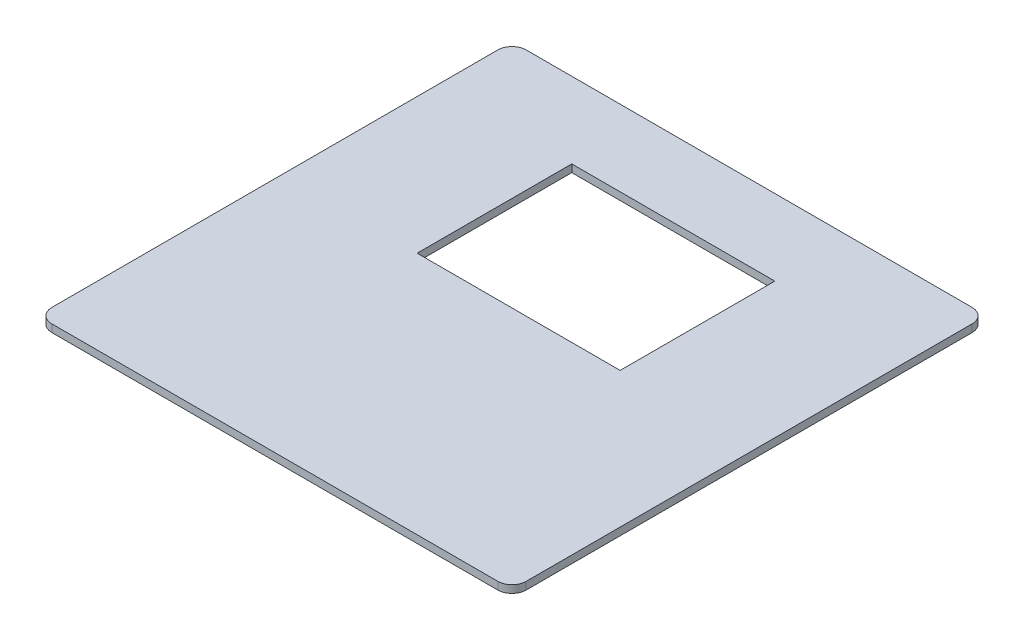
ISO-10303-21;
HEADER;
FILE_DESCRIPTION(('STEP AP214'),'2;1');
FILE_NAME('part.step','',(''),(''),'','','');
FILE_SCHEMA(('AUTOMOTIVE_DESIGN { 1 0 10303 214 1 1 1 1 }'));
ENDSEC;
DATA;
#1=APPLICATION_CONTEXT('core data for automotive mechanical design processes');
#2=APPLICATION_PROTOCOL_DEFINITION('international standard','automotive_design',2000,#1);
#3=PRODUCT_CONTEXT('',#1,'mechanical');
#4=PRODUCT('Part','Part','',(#3));
#5=PRODUCT_RELATED_PRODUCT_CATEGORY('part','',(#4));
#6=PRODUCT_DEFINITION_FORMATION('','',#4);
#7=PRODUCT_DEFINITION_CONTEXT('part definition',#1,'design');
#8=PRODUCT_DEFINITION('design','',#6,#7);
#9=PRODUCT_DEFINITION_SHAPE('','',#8);
#10=(LENGTH_UNIT() NAMED_UNIT(*) SI_UNIT(.MILLI.,.METRE.));
#11=(NAMED_UNIT(*) PLANE_ANGLE_UNIT() SI_UNIT($,.RADIAN.));
#12=(NAMED_UNIT(*) SI_UNIT($,.STERADIAN.) SOLID_ANGLE_UNIT());
#13=UNCERTAINTY_MEASURE_WITH_UNIT(LENGTH_MEASURE(1.E-05),#10,'distance_accuracy_value','');
#14=(GEOMETRIC_REPRESENTATION_CONTEXT(3) GLOBAL_UNCERTAINTY_ASSIGNED_CONTEXT((#13)) GLOBAL_UNIT_ASSIGNED_CONTEXT((#10,
#11,#12)) REPRESENTATION_CONTEXT('',''));
#15=CARTESIAN_POINT('',(0.,0.,0.));
#16=DIRECTION('',(0.,0.,1.));
#17=DIRECTION('',(1.,0.,0.));
#18=AXIS2_PLACEMENT_3D('',#15,#16,#17);
#19=CARTESIAN_POINT('',(0.,4.22,0.));
#20=DIRECTION('',(0.,1.,0.));
#21=DIRECTION('',(0.,0.,1.));
#22=AXIS2_PLACEMENT_3D('',#19,#20,#21);
#23=PLANE('',#22);
#24=DIRECTION('',(1.,0.,0.));
#25=VECTOR('',#24,1.);
#26=CARTESIAN_POINT('',(-116.833372466683,4.22,59.6638547065308));
#27=LINE('',#26,#25);
#28=CARTESIAN_POINT('',(-113.833372466683,4.22,59.6638547065308));
#29=VERTEX_POINT('',#28);
#30=CARTESIAN_POINT('',(-19.8333724666831,4.22,59.6638547065308));
#31=VERTEX_POINT('',#30);
#32=EDGE_CURVE('E203',#29,#31,#27,.T.);
#33=ORIENTED_EDGE('',*,*,#32,.T.);
#34=CARTESIAN_POINT('',(-19.8333724666831,4.22,56.6638547065308));
#35=DIRECTION('',(0.,1.,0.));
#36=DIRECTION('',(0.,0.,1.));
#37=AXIS2_PLACEMENT_3D('',#34,#35,#36);
#38=CIRCLE('',#37,3.);
#39=CARTESIAN_POINT('',(-16.8333724666831,4.22,56.6638547065308));
#40=VERTEX_POINT('',#39);
#41=EDGE_CURVE('E258',#31,#40,#38,.T.);
#42=ORIENTED_EDGE('',*,*,#41,.T.);
#43=DIRECTION('',(0.,0.,-1.));
#44=VECTOR('',#43,1.);
#45=CARTESIAN_POINT('',(-16.8333724666831,4.22,-40.3361452934692));
#46=LINE('',#45,#44);
#47=CARTESIAN_POINT('',(-16.8333724666831,4.22,-37.3361452934692));
#48=VERTEX_POINT('',#47);
#49=EDGE_CURVE('E208',#40,#48,#46,.T.);
#50=ORIENTED_EDGE('',*,*,#49,.T.);
#51=CARTESIAN_POINT('',(-19.8333724666831,4.22,-37.3361452934692));
#52=DIRECTION('',(0.,1.,0.));
#53=DIRECTION('',(0.,0.,1.));
#54=AXIS2_PLACEMENT_3D('',#51,#52,#53);
#55=CIRCLE('',#54,3.);
#56=CARTESIAN_POINT('',(-19.8333724666831,4.22,-40.3361452934692));
#57=VERTEX_POINT('',#56);
#58=EDGE_CURVE('E62',#48,#57,#55,.T.);
#59=ORIENTED_EDGE('',*,*,#58,.T.);
#60=DIRECTION('',(-1.,0.,0.));
#61=VECTOR('',#60,1.);
#62=CARTESIAN_POINT('',(-116.833372466683,4.22,-40.3361452934692));
#63=LINE('',#62,#61);
#64=CARTESIAN_POINT('',(-113.833372466683,4.22,-40.3361452934692));
#65=VERTEX_POINT('',#64);
#66=EDGE_CURVE('E211',#57,#65,#63,.T.);
#67=ORIENTED_EDGE('',*,*,#66,.T.);
#68=CARTESIAN_POINT('',(-113.833372466683,4.22,-37.3361452934692));
#69=DIRECTION('',(0.,1.,0.));
#70=DIRECTION('',(0.,0.,1.));
#71=AXIS2_PLACEMENT_3D('',#68,#69,#70);
#72=CIRCLE('',#71,3.);
#73=CARTESIAN_POINT('',(-116.833372466683,4.22,-37.3361452934692));
#74=VERTEX_POINT('',#73);
#75=EDGE_CURVE('E252',#65,#74,#72,.T.);
#76=ORIENTED_EDGE('',*,*,#75,.T.);
#77=DIRECTION('',(0.,0.,1.));
#78=VECTOR('',#77,1.);
#79=CARTESIAN_POINT('',(-116.833372466683,4.22,-40.3361452934692));
#80=LINE('',#79,#78);
#81=CARTESIAN_POINT('',(-116.833372466683,4.22,56.6638547065308));
#82=VERTEX_POINT('',#81);
#83=EDGE_CURVE('E199',#74,#82,#80,.T.);
#84=ORIENTED_EDGE('',*,*,#83,.T.);
#85=CARTESIAN_POINT('',(-113.833372466683,4.22,56.6638547065308));
#86=DIRECTION('',(0.,1.,0.));
#87=DIRECTION('',(0.,0.,1.));
#88=AXIS2_PLACEMENT_3D('',#85,#86,#87);
#89=CIRCLE('',#88,3.);
#90=EDGE_CURVE('E255',#82,#29,#89,.T.);
#91=ORIENTED_EDGE('',*,*,#90,.T.);
#92=EDGE_LOOP('',(#33,#42,#50,#59,#67,#76,#84,#91));
#93=FACE_BOUND('',#92,.T.);
#94=DIRECTION('',(0.,0.,1.));
#95=VECTOR('',#94,1.);
#96=CARTESIAN_POINT('',(-88.2333724666831,4.22,-24.3361452934692));
#97=LINE('',#96,#95);
#98=CARTESIAN_POINT('',(-88.2333724666831,4.22,-24.3361452934692));
#99=VERTEX_POINT('',#98);
#100=CARTESIAN_POINT('',(-88.2333724666831,4.22,8.26385470653076));
#101=VERTEX_POINT('',#100);
#102=EDGE_CURVE('E158',#99,#101,#97,.T.);
#103=ORIENTED_EDGE('',*,*,#102,.F.);
#104=DIRECTION('',(-1.,0.,0.));
#105=VECTOR('',#104,1.);
#106=CARTESIAN_POINT('',(-45.4333724666831,4.22,-24.3361452934692));
#107=LINE('',#106,#105);
#108=CARTESIAN_POINT('',(-45.4333724666831,4.22,-24.3361452934692));
#109=VERTEX_POINT('',#108);
#110=EDGE_CURVE('E147',#109,#99,#107,.T.);
#111=ORIENTED_EDGE('',*,*,#110,.F.);
#112=DIRECTION('',(0.,0.,-1.));
#113=VECTOR('',#112,1.);
#114=CARTESIAN_POINT('',(-45.4333724666831,4.22,8.26385470653078));
#115=LINE('',#114,#113);
#116=CARTESIAN_POINT('',(-45.4333724666831,4.22,8.26385470653078));
#117=VERTEX_POINT('',#116);
#118=EDGE_CURVE('E177',#117,#109,#115,.T.);
#119=ORIENTED_EDGE('',*,*,#118,.F.);
#120=DIRECTION('',(1.,0.,0.));
#121=VECTOR('',#120,1.);
#122=CARTESIAN_POINT('',(-88.2333724666831,4.22,8.26385470653076));
#123=LINE('',#122,#121);
#124=EDGE_CURVE('E171',#101,#117,#123,.T.);
#125=ORIENTED_EDGE('',*,*,#124,.F.);
#126=EDGE_LOOP('',(#103,#111,#119,#125));
#127=FACE_BOUND('',#126,.T.);
#128=ADVANCED_FACE('F39',(#93,#127),#23,.T.);
#129=CARTESIAN_POINT('',(0.,2.62,0.));
#130=DIRECTION('',(0.,1.,0.));
#131=DIRECTION('',(0.,0.,1.));
#132=AXIS2_PLACEMENT_3D('',#129,#130,#131);
#133=PLANE('',#132);
#134=DIRECTION('',(0.,0.,-1.));
#135=VECTOR('',#134,1.);
#136=CARTESIAN_POINT('',(-16.8333724666831,2.62,-40.3361452934692));
#137=LINE('',#136,#135);
#138=CARTESIAN_POINT('',(-16.8333724666831,2.62,56.6638547065308));
#139=VERTEX_POINT('',#138);
#140=CARTESIAN_POINT('',(-16.8333724666831,2.62,-37.3361452934692));
#141=VERTEX_POINT('',#140);
#142=EDGE_CURVE('E222',#139,#141,#137,.T.);
#143=ORIENTED_EDGE('',*,*,#142,.F.);
#144=CARTESIAN_POINT('',(-19.8333724666831,2.62,56.6638547065308));
#145=DIRECTION('',(0.,1.,0.));
#146=DIRECTION('',(0.,0.,1.));
#147=AXIS2_PLACEMENT_3D('',#144,#145,#146);
#148=CIRCLE('',#147,3.);
#149=CARTESIAN_POINT('',(-19.8333724666831,2.62,59.6638547065308));
#150=VERTEX_POINT('',#149);
#151=EDGE_CURVE('E241',#139,#150,#148,.F.);
#152=ORIENTED_EDGE('',*,*,#151,.T.);
#153=DIRECTION('',(1.,0.,0.));
#154=VECTOR('',#153,1.);
#155=CARTESIAN_POINT('',(-116.833372466683,2.62,59.6638547065308));
#156=LINE('',#155,#154);
#157=CARTESIAN_POINT('',(-113.833372466683,2.62,59.6638547065308));
#158=VERTEX_POINT('',#157);
#159=EDGE_CURVE('E218',#158,#150,#156,.T.);
#160=ORIENTED_EDGE('',*,*,#159,.F.);
#161=CARTESIAN_POINT('',(-113.833372466683,2.62,56.6638547065308));
#162=DIRECTION('',(0.,1.,0.));
#163=DIRECTION('',(0.,0.,1.));
#164=AXIS2_PLACEMENT_3D('',#161,#162,#163);
#165=CIRCLE('',#164,3.);
#166=CARTESIAN_POINT('',(-116.833372466683,2.62,56.6638547065308));
#167=VERTEX_POINT('',#166);
#168=EDGE_CURVE('E238',#158,#167,#165,.F.);
#169=ORIENTED_EDGE('',*,*,#168,.T.);
#170=DIRECTION('',(0.,0.,1.));
#171=VECTOR('',#170,1.);
#172=CARTESIAN_POINT('',(-116.833372466683,2.62,-40.3361452934692));
#173=LINE('',#172,#171);
#174=CARTESIAN_POINT('',(-116.833372466683,2.62,-37.3361452934692));
#175=VERTEX_POINT('',#174);
#176=EDGE_CURVE('E166',#175,#167,#173,.T.);
#177=ORIENTED_EDGE('',*,*,#176,.F.);
#178=CARTESIAN_POINT('',(-113.833372466683,2.62,-37.3361452934692));
#179=DIRECTION('',(0.,1.,0.));
#180=DIRECTION('',(0.,0.,1.));
#181=AXIS2_PLACEMENT_3D('',#178,#179,#180);
#182=CIRCLE('',#181,3.);
#183=CARTESIAN_POINT('',(-113.833372466683,2.62,-40.3361452934692));
#184=VERTEX_POINT('',#183);
#185=EDGE_CURVE('E235',#175,#184,#182,.F.);
#186=ORIENTED_EDGE('',*,*,#185,.T.);
#187=DIRECTION('',(-1.,0.,0.));
#188=VECTOR('',#187,1.);
#189=CARTESIAN_POINT('',(-116.833372466683,2.62,-40.3361452934692));
#190=LINE('',#189,#188);
#191=CARTESIAN_POINT('',(-19.8333724666831,2.62,-40.3361452934692));
#192=VERTEX_POINT('',#191);
#193=EDGE_CURVE('E204',#192,#184,#190,.T.);
#194=ORIENTED_EDGE('',*,*,#193,.F.);
#195=CARTESIAN_POINT('',(-19.8333724666831,2.62,-37.3361452934692));
#196=DIRECTION('',(0.,1.,0.));
#197=DIRECTION('',(0.,0.,1.));
#198=AXIS2_PLACEMENT_3D('',#195,#196,#197);
#199=CIRCLE('',#198,3.);
#200=EDGE_CURVE('E233',#192,#141,#199,.F.);
#201=ORIENTED_EDGE('',*,*,#200,.T.);
#202=EDGE_LOOP('',(#143,#152,#160,#169,#177,#186,#194,#201));
#203=FACE_BOUND('',#202,.T.);
#204=DIRECTION('',(-1.,0.,0.));
#205=VECTOR('',#204,1.);
#206=CARTESIAN_POINT('',(-45.4333724666831,2.62,-24.3361452934692));
#207=LINE('',#206,#205);
#208=CARTESIAN_POINT('',(-45.4333724666831,2.62,-24.3361452934692));
#209=VERTEX_POINT('',#208);
#210=CARTESIAN_POINT('',(-88.2333724666831,2.62,-24.3361452934692));
#211=VERTEX_POINT('',#210);
#212=EDGE_CURVE('E182',#209,#211,#207,.T.);
#213=ORIENTED_EDGE('',*,*,#212,.T.);
#214=DIRECTION('',(0.,0.,1.));
#215=VECTOR('',#214,1.);
#216=CARTESIAN_POINT('',(-88.2333724666831,2.62,-24.3361452934692));
#217=LINE('',#216,#215);
#218=CARTESIAN_POINT('',(-88.2333724666831,2.62,8.26385470653076));
#219=VERTEX_POINT('',#218);
#220=EDGE_CURVE('E165',#211,#219,#217,.T.);
#221=ORIENTED_EDGE('',*,*,#220,.T.);
#222=DIRECTION('',(1.,0.,0.));
#223=VECTOR('',#222,1.);
#224=CARTESIAN_POINT('',(-88.2333724666831,2.62,8.26385470653076));
#225=LINE('',#224,#223);
#226=CARTESIAN_POINT('',(-45.4333724666831,2.62,8.26385470653078));
#227=VERTEX_POINT('',#226);
#228=EDGE_CURVE('E185',#219,#227,#225,.T.);
#229=ORIENTED_EDGE('',*,*,#228,.T.);
#230=DIRECTION('',(0.,0.,-1.));
#231=VECTOR('',#230,1.);
#232=CARTESIAN_POINT('',(-45.4333724666831,2.62,8.26385470653078));
#233=LINE('',#232,#231);
#234=EDGE_CURVE('E159',#227,#209,#233,.T.);
#235=ORIENTED_EDGE('',*,*,#234,.T.);
#236=EDGE_LOOP('',(#213,#221,#229,#235));
#237=FACE_BOUND('',#236,.T.);
#238=ADVANCED_FACE('F274',(#203,#237),#133,.F.);
#239=CARTESIAN_POINT('',(-116.833372466683,4.22,-40.3361452934692));
#240=DIRECTION('',(1.,0.,0.));
#241=DIRECTION('',(0.,0.,-1.));
#242=AXIS2_PLACEMENT_3D('',#239,#240,#241);
#243=PLANE('',#242);
#244=ORIENTED_EDGE('',*,*,#176,.T.);
#245=DIRECTION('',(0.,-1.,0.));
#246=VECTOR('',#245,1.);
#247=CARTESIAN_POINT('',(-116.833372466683,4.22,56.6638547065308));
#248=LINE('',#247,#246);
#249=EDGE_CURVE('E265',#167,#82,#248,.F.);
#250=ORIENTED_EDGE('',*,*,#249,.T.);
#251=ORIENTED_EDGE('',*,*,#83,.F.);
#252=DIRECTION('',(0.,-1.,0.));
#253=VECTOR('',#252,1.);
#254=CARTESIAN_POINT('',(-116.833372466683,4.22,-37.3361452934692));
#255=LINE('',#254,#253);
#256=EDGE_CURVE('E261',#74,#175,#255,.T.);
#257=ORIENTED_EDGE('',*,*,#256,.T.);
#258=EDGE_LOOP('',(#244,#250,#251,#257));
#259=FACE_BOUND('',#258,.T.);
#260=ADVANCED_FACE('F283',(#259),#243,.F.);
#261=CARTESIAN_POINT('',(-116.833372466683,4.22,59.6638547065308));
#262=DIRECTION('',(0.,0.,-1.));
#263=DIRECTION('',(-1.,0.,0.));
#264=AXIS2_PLACEMENT_3D('',#261,#262,#263);
#265=PLANE('',#264);
#266=ORIENTED_EDGE('',*,*,#159,.T.);
#267=DIRECTION('',(0.,-1.,0.));
#268=VECTOR('',#267,1.);
#269=CARTESIAN_POINT('',(-19.8333724666831,4.22,59.6638547065308));
#270=LINE('',#269,#268);
#271=EDGE_CURVE('E248',#150,#31,#270,.F.);
#272=ORIENTED_EDGE('',*,*,#271,.T.);
#273=ORIENTED_EDGE('',*,*,#32,.F.);
#274=DIRECTION('',(0.,-1.,0.));
#275=VECTOR('',#274,1.);
#276=CARTESIAN_POINT('',(-113.833372466683,4.22,59.6638547065308));
#277=LINE('',#276,#275);
#278=EDGE_CURVE('E244',#29,#158,#277,.T.);
#279=ORIENTED_EDGE('',*,*,#278,.T.);
#280=EDGE_LOOP('',(#266,#272,#273,#279));
#281=FACE_BOUND('',#280,.T.);
#282=ADVANCED_FACE('F292',(#281),#265,.F.);
#283=CARTESIAN_POINT('',(-16.8333724666831,4.22,-40.3361452934692));
#284=DIRECTION('',(-1.,0.,0.));
#285=DIRECTION('',(0.,0.,1.));
#286=AXIS2_PLACEMENT_3D('',#283,#284,#285);
#287=PLANE('',#286);
#288=ORIENTED_EDGE('',*,*,#49,.F.);
#289=DIRECTION('',(0.,-1.,0.));
#290=VECTOR('',#289,1.);
#291=CARTESIAN_POINT('',(-16.8333724666831,4.22,56.6638547065308));
#292=LINE('',#291,#290);
#293=EDGE_CURVE('E229',#40,#139,#292,.T.);
#294=ORIENTED_EDGE('',*,*,#293,.T.);
#295=ORIENTED_EDGE('',*,*,#142,.T.);
#296=DIRECTION('',(0.,-1.,0.));
#297=VECTOR('',#296,1.);
#298=CARTESIAN_POINT('',(-16.8333724666831,4.22,-37.3361452934692));
#299=LINE('',#298,#297);
#300=EDGE_CURVE('E214',#141,#48,#299,.F.);
#301=ORIENTED_EDGE('',*,*,#300,.T.);
#302=EDGE_LOOP('',(#288,#294,#295,#301));
#303=FACE_BOUND('',#302,.T.);
#304=ADVANCED_FACE('F300',(#303),#287,.F.);
#305=CARTESIAN_POINT('',(-116.833372466683,4.22,-40.3361452934692));
#306=DIRECTION('',(0.,0.,1.));
#307=DIRECTION('',(1.,0.,0.));
#308=AXIS2_PLACEMENT_3D('',#305,#306,#307);
#309=PLANE('',#308);
#310=ORIENTED_EDGE('',*,*,#193,.T.);
#311=DIRECTION('',(0.,-1.,0.));
#312=VECTOR('',#311,1.);
#313=CARTESIAN_POINT('',(-113.833372466683,4.22,-40.3361452934692));
#314=LINE('',#313,#312);
#315=EDGE_CURVE('E11',#184,#65,#314,.F.);
#316=ORIENTED_EDGE('',*,*,#315,.T.);
#317=ORIENTED_EDGE('',*,*,#66,.F.);
#318=DIRECTION('',(0.,-1.,0.));
#319=VECTOR('',#318,1.);
#320=CARTESIAN_POINT('',(-19.8333724666831,4.22,-40.3361452934692));
#321=LINE('',#320,#319);
#322=EDGE_CURVE('E48',#57,#192,#321,.T.);
#323=ORIENTED_EDGE('',*,*,#322,.T.);
#324=EDGE_LOOP('',(#310,#316,#317,#323));
#325=FACE_BOUND('',#324,.T.);
#326=ADVANCED_FACE('F270',(#325),#309,.F.);
#327=CARTESIAN_POINT('',(-45.4333724666831,4.22,-24.3361452934692));
#328=DIRECTION('',(0.,0.,1.));
#329=DIRECTION('',(1.,0.,0.));
#330=AXIS2_PLACEMENT_3D('',#327,#328,#329);
#331=PLANE('',#330);
#332=ORIENTED_EDGE('',*,*,#212,.F.);
#333=DIRECTION('',(0.,-1.,0.));
#334=VECTOR('',#333,1.);
#335=CARTESIAN_POINT('',(-45.4333724666831,4.22,-24.3361452934692));
#336=LINE('',#335,#334);
#337=EDGE_CURVE('E153',#109,#209,#336,.T.);
#338=ORIENTED_EDGE('',*,*,#337,.F.);
#339=ORIENTED_EDGE('',*,*,#110,.T.);
#340=DIRECTION('',(0.,-1.,0.));
#341=VECTOR('',#340,1.);
#342=CARTESIAN_POINT('',(-88.2333724666831,4.22,-24.3361452934692));
#343=LINE('',#342,#341);
#344=EDGE_CURVE('E150',#99,#211,#343,.T.);
#345=ORIENTED_EDGE('',*,*,#344,.T.);
#346=EDGE_LOOP('',(#332,#338,#339,#345));
#347=FACE_BOUND('',#346,.T.);
#348=ADVANCED_FACE('F149',(#347),#331,.T.);
#349=CARTESIAN_POINT('',(-88.2333724666831,4.22,-24.3361452934692));
#350=DIRECTION('',(1.,0.,0.));
#351=DIRECTION('',(0.,0.,-1.));
#352=AXIS2_PLACEMENT_3D('',#349,#350,#351);
#353=PLANE('',#352);
#354=ORIENTED_EDGE('',*,*,#220,.F.);
#355=ORIENTED_EDGE('',*,*,#344,.F.);
#356=ORIENTED_EDGE('',*,*,#102,.T.);
#357=DIRECTION('',(0.,-1.,0.));
#358=VECTOR('',#357,1.);
#359=CARTESIAN_POINT('',(-88.2333724666831,4.22,8.26385470653076));
#360=LINE('',#359,#358);
#361=EDGE_CURVE('E167',#101,#219,#360,.T.);
#362=ORIENTED_EDGE('',*,*,#361,.T.);
#363=EDGE_LOOP('',(#354,#355,#356,#362));
#364=FACE_BOUND('',#363,.T.);
#365=ADVANCED_FACE('F162',(#364),#353,.T.);
#366=CARTESIAN_POINT('',(-88.2333724666831,4.22,8.26385470653076));
#367=DIRECTION('',(0.,0.,-1.));
#368=DIRECTION('',(-1.,0.,0.));
#369=AXIS2_PLACEMENT_3D('',#366,#367,#368);
#370=PLANE('',#369);
#371=ORIENTED_EDGE('',*,*,#228,.F.);
#372=ORIENTED_EDGE('',*,*,#361,.F.);
#373=ORIENTED_EDGE('',*,*,#124,.T.);
#374=DIRECTION('',(0.,-1.,0.));
#375=VECTOR('',#374,1.);
#376=CARTESIAN_POINT('',(-45.4333724666831,4.22,8.26385470653078));
#377=LINE('',#376,#375);
#378=EDGE_CURVE('E194',#117,#227,#377,.T.);
#379=ORIENTED_EDGE('',*,*,#378,.T.);
#380=EDGE_LOOP('',(#371,#372,#373,#379));
#381=FACE_BOUND('',#380,.T.);
#382=ADVANCED_FACE('F356',(#381),#370,.T.);
#383=CARTESIAN_POINT('',(-45.4333724666831,4.22,8.26385470653078));
#384=DIRECTION('',(-1.,0.,0.));
#385=DIRECTION('',(0.,0.,1.));
#386=AXIS2_PLACEMENT_3D('',#383,#384,#385);
#387=PLANE('',#386);
#388=ORIENTED_EDGE('',*,*,#234,.F.);
#389=ORIENTED_EDGE('',*,*,#378,.F.);
#390=ORIENTED_EDGE('',*,*,#118,.T.);
#391=ORIENTED_EDGE('',*,*,#337,.T.);
#392=EDGE_LOOP('',(#388,#389,#390,#391));
#393=FACE_BOUND('',#392,.T.);
#394=ADVANCED_FACE('F325',(#393),#387,.T.);
#395=CARTESIAN_POINT('',(-19.8333724666831,4.22,56.6638547065308));
#396=DIRECTION('',(0.,-1.,0.));
#397=DIRECTION('',(0.,0.,-1.));
#398=AXIS2_PLACEMENT_3D('',#395,#396,#397);
#399=CYLINDRICAL_SURFACE('',#398,3.);
#400=ORIENTED_EDGE('',*,*,#41,.F.);
#401=ORIENTED_EDGE('',*,*,#271,.F.);
#402=ORIENTED_EDGE('',*,*,#151,.F.);
#403=ORIENTED_EDGE('',*,*,#293,.F.);
#404=EDGE_LOOP('',(#400,#401,#402,#403));
#405=FACE_BOUND('',#404,.T.);
#406=ADVANCED_FACE('F297',(#405),#399,.T.);
#407=CARTESIAN_POINT('',(-113.833372466683,4.22,56.6638547065308));
#408=DIRECTION('',(0.,-1.,0.));
#409=DIRECTION('',(0.,0.,-1.));
#410=AXIS2_PLACEMENT_3D('',#407,#408,#409);
#411=CYLINDRICAL_SURFACE('',#410,3.);
#412=ORIENTED_EDGE('',*,*,#90,.F.);
#413=ORIENTED_EDGE('',*,*,#249,.F.);
#414=ORIENTED_EDGE('',*,*,#168,.F.);
#415=ORIENTED_EDGE('',*,*,#278,.F.);
#416=EDGE_LOOP('',(#412,#413,#414,#415));
#417=FACE_BOUND('',#416,.T.);
#418=ADVANCED_FACE('F289',(#417),#411,.T.);
#419=CARTESIAN_POINT('',(-113.833372466683,4.22,-37.3361452934692));
#420=DIRECTION('',(0.,-1.,0.));
#421=DIRECTION('',(0.,0.,-1.));
#422=AXIS2_PLACEMENT_3D('',#419,#420,#421);
#423=CYLINDRICAL_SURFACE('',#422,3.);
#424=ORIENTED_EDGE('',*,*,#75,.F.);
#425=ORIENTED_EDGE('',*,*,#315,.F.);
#426=ORIENTED_EDGE('',*,*,#185,.F.);
#427=ORIENTED_EDGE('',*,*,#256,.F.);
#428=EDGE_LOOP('',(#424,#425,#426,#427));
#429=FACE_BOUND('',#428,.T.);
#430=ADVANCED_FACE('F280',(#429),#423,.T.);
#431=CARTESIAN_POINT('',(-19.8333724666831,4.22,-37.3361452934692));
#432=DIRECTION('',(0.,-1.,0.));
#433=DIRECTION('',(0.,0.,-1.));
#434=AXIS2_PLACEMENT_3D('',#431,#432,#433);
#435=CYLINDRICAL_SURFACE('',#434,3.);
#436=ORIENTED_EDGE('',*,*,#58,.F.);
#437=ORIENTED_EDGE('',*,*,#300,.F.);
#438=ORIENTED_EDGE('',*,*,#200,.F.);
#439=ORIENTED_EDGE('',*,*,#322,.F.);
#440=EDGE_LOOP('',(#436,#437,#438,#439));
#441=FACE_BOUND('',#440,.T.);
#442=ADVANCED_FACE('F41',(#441),#435,.T.);
#443=CLOSED_SHELL('',(#128,#238,#260,#282,#304,#326,#348,#365,#382,#394,#406,#418,#430,#442));
#444=MANIFOLD_SOLID_BREP('B2',#443);
#445=ADVANCED_BREP_SHAPE_REPRESENTATION('',(#18,#444),#14);
#446=SHAPE_DEFINITION_REPRESENTATION(#9,#445);
ENDSEC;
END-ISO-10303-21;
